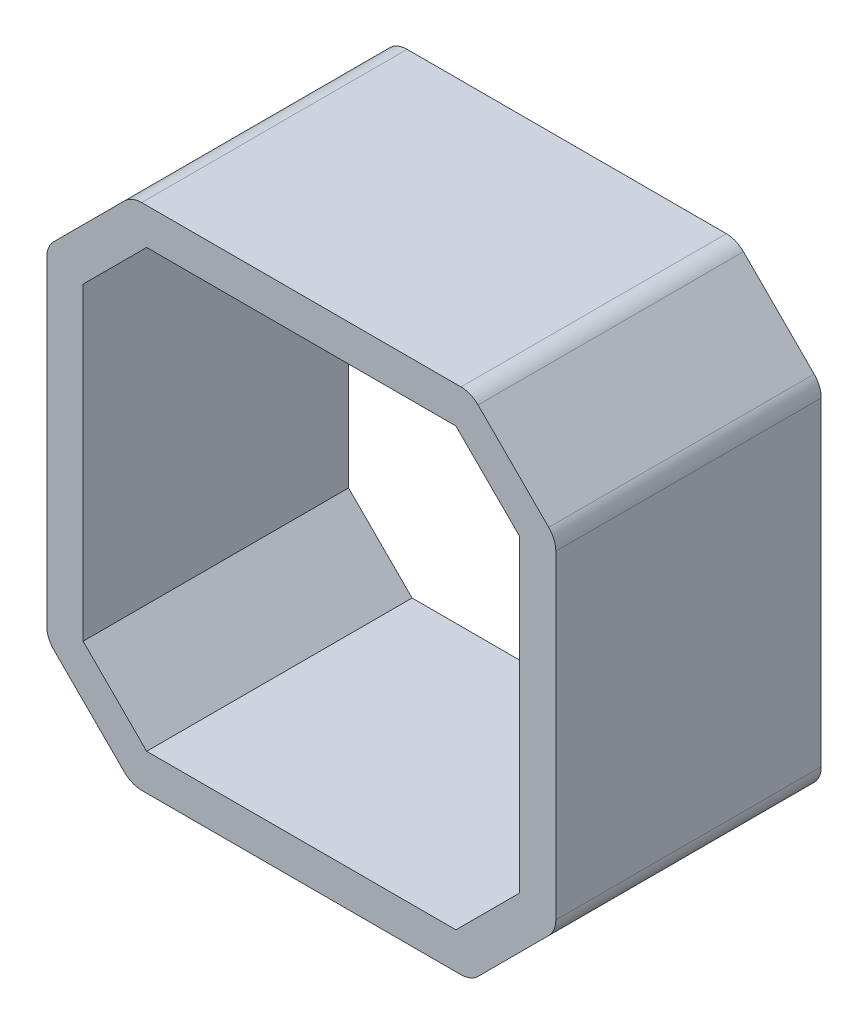
ISO-10303-21;
HEADER;
FILE_DESCRIPTION(('STEP AP214'),'2;1');
FILE_NAME('part.step','',(''),(''),'','','');
FILE_SCHEMA(('AUTOMOTIVE_DESIGN { 1 0 10303 214 1 1 1 1 }'));
ENDSEC;
DATA;
#1=APPLICATION_CONTEXT('core data for automotive mechanical design processes');
#2=APPLICATION_PROTOCOL_DEFINITION('international standard','automotive_design',2000,#1);
#3=PRODUCT_CONTEXT('',#1,'mechanical');
#4=PRODUCT('Part','Part','',(#3));
#5=PRODUCT_RELATED_PRODUCT_CATEGORY('part','',(#4));
#6=PRODUCT_DEFINITION_FORMATION('','',#4);
#7=PRODUCT_DEFINITION_CONTEXT('part definition',#1,'design');
#8=PRODUCT_DEFINITION('design','',#6,#7);
#9=PRODUCT_DEFINITION_SHAPE('','',#8);
#10=(LENGTH_UNIT() NAMED_UNIT(*) SI_UNIT(.MILLI.,.METRE.));
#11=(NAMED_UNIT(*) PLANE_ANGLE_UNIT() SI_UNIT($,.RADIAN.));
#12=(NAMED_UNIT(*) SI_UNIT($,.STERADIAN.) SOLID_ANGLE_UNIT());
#13=UNCERTAINTY_MEASURE_WITH_UNIT(LENGTH_MEASURE(1.E-05),#10,'distance_accuracy_value','');
#14=(GEOMETRIC_REPRESENTATION_CONTEXT(3) GLOBAL_UNCERTAINTY_ASSIGNED_CONTEXT((#13)) GLOBAL_UNIT_ASSIGNED_CONTEXT((#10,
#11,#12)) REPRESENTATION_CONTEXT('',''));
#15=CARTESIAN_POINT('',(0.,0.,0.));
#16=DIRECTION('',(0.,0.,1.));
#17=DIRECTION('',(1.,0.,0.));
#18=AXIS2_PLACEMENT_3D('',#15,#16,#17);
#19=CARTESIAN_POINT('',(0.,0.,10.95));
#20=DIRECTION('',(0.,0.,1.));
#21=DIRECTION('',(1.,0.,0.));
#22=AXIS2_PLACEMENT_3D('',#19,#20,#21);
#23=PLANE('',#22);
#24=DIRECTION('',(0.707106781186548,-0.707106781186547,0.));
#25=VECTOR('',#24,1.);
#26=CARTESIAN_POINT('',(21.,14.,10.95));
#27=LINE('',#26,#25);
#28=CARTESIAN_POINT('',(14.5857864376269,20.4142135623731,10.95));
#29=VERTEX_POINT('',#28);
#30=CARTESIAN_POINT('',(20.4142135623731,14.5857864376269,10.95));
#31=VERTEX_POINT('',#30);
#32=EDGE_CURVE('E484',#29,#31,#27,.T.);
#33=ORIENTED_EDGE('',*,*,#32,.F.);
#34=CARTESIAN_POINT('',(13.1715728752538,19.,10.95));
#35=DIRECTION('',(0.,0.,1.));
#36=DIRECTION('',(1.,0.,0.));
#37=AXIS2_PLACEMENT_3D('',#34,#35,#36);
#38=CIRCLE('',#37,2.);
#39=CARTESIAN_POINT('',(13.1715728752538,21.,10.95));
#40=VERTEX_POINT('',#39);
#41=EDGE_CURVE('E561',#29,#40,#38,.T.);
#42=ORIENTED_EDGE('',*,*,#41,.T.);
#43=DIRECTION('',(-1.,0.,0.));
#44=VECTOR('',#43,1.);
#45=CARTESIAN_POINT('',(-21.,21.,10.95));
#46=LINE('',#45,#44);
#47=CARTESIAN_POINT('',(-13.1715728752538,21.,10.95));
#48=VERTEX_POINT('',#47);
#49=EDGE_CURVE('E506',#40,#48,#46,.T.);
#50=ORIENTED_EDGE('',*,*,#49,.T.);
#51=CARTESIAN_POINT('',(-13.1715728752538,19.,10.95));
#52=DIRECTION('',(0.,0.,1.));
#53=DIRECTION('',(1.,0.,0.));
#54=AXIS2_PLACEMENT_3D('',#51,#52,#53);
#55=CIRCLE('',#54,2.);
#56=CARTESIAN_POINT('',(-14.5857864376269,20.4142135623731,10.95));
#57=VERTEX_POINT('',#56);
#58=EDGE_CURVE('E540',#48,#57,#55,.T.);
#59=ORIENTED_EDGE('',*,*,#58,.T.);
#60=DIRECTION('',(0.707106781186547,0.707106781186547,0.));
#61=VECTOR('',#60,1.);
#62=CARTESIAN_POINT('',(-21.,14.,10.95));
#63=LINE('',#62,#61);
#64=CARTESIAN_POINT('',(-20.4142135623731,14.5857864376269,10.95));
#65=VERTEX_POINT('',#64);
#66=EDGE_CURVE('E497',#65,#57,#63,.T.);
#67=ORIENTED_EDGE('',*,*,#66,.F.);
#68=CARTESIAN_POINT('',(-19.,13.1715728752538,10.95));
#69=DIRECTION('',(0.,0.,1.));
#70=DIRECTION('',(1.,0.,0.));
#71=AXIS2_PLACEMENT_3D('',#68,#69,#70);
#72=CIRCLE('',#71,2.);
#73=CARTESIAN_POINT('',(-21.,13.1715728752538,10.95));
#74=VERTEX_POINT('',#73);
#75=EDGE_CURVE('E543',#65,#74,#72,.T.);
#76=ORIENTED_EDGE('',*,*,#75,.T.);
#77=DIRECTION('',(0.,-1.,0.));
#78=VECTOR('',#77,1.);
#79=CARTESIAN_POINT('',(-21.,21.,10.95));
#80=LINE('',#79,#78);
#81=CARTESIAN_POINT('',(-21.,-13.1715728752538,10.95));
#82=VERTEX_POINT('',#81);
#83=EDGE_CURVE('E511',#74,#82,#80,.T.);
#84=ORIENTED_EDGE('',*,*,#83,.T.);
#85=CARTESIAN_POINT('',(-19.,-13.1715728752538,10.95));
#86=DIRECTION('',(0.,0.,1.));
#87=DIRECTION('',(1.,0.,0.));
#88=AXIS2_PLACEMENT_3D('',#85,#86,#87);
#89=CIRCLE('',#88,2.);
#90=CARTESIAN_POINT('',(-20.4142135623731,-14.5857864376269,10.95));
#91=VERTEX_POINT('',#90);
#92=EDGE_CURVE('E546',#82,#91,#89,.T.);
#93=ORIENTED_EDGE('',*,*,#92,.T.);
#94=DIRECTION('',(-0.707106781186547,0.707106781186547,0.));
#95=VECTOR('',#94,1.);
#96=CARTESIAN_POINT('',(-21.,-14.,10.95));
#97=LINE('',#96,#95);
#98=CARTESIAN_POINT('',(-14.5857864376269,-20.4142135623731,10.95));
#99=VERTEX_POINT('',#98);
#100=EDGE_CURVE('E474',#99,#91,#97,.T.);
#101=ORIENTED_EDGE('',*,*,#100,.F.);
#102=CARTESIAN_POINT('',(-13.1715728752538,-19.,10.95));
#103=DIRECTION('',(0.,0.,1.));
#104=DIRECTION('',(1.,0.,0.));
#105=AXIS2_PLACEMENT_3D('',#102,#103,#104);
#106=CIRCLE('',#105,2.);
#107=CARTESIAN_POINT('',(-13.1715728752538,-21.,10.95));
#108=VERTEX_POINT('',#107);
#109=EDGE_CURVE('E549',#99,#108,#106,.T.);
#110=ORIENTED_EDGE('',*,*,#109,.T.);
#111=DIRECTION('',(1.,0.,0.));
#112=VECTOR('',#111,1.);
#113=CARTESIAN_POINT('',(-21.,-21.,10.95));
#114=LINE('',#113,#112);
#115=CARTESIAN_POINT('',(13.1715728752538,-21.,10.95));
#116=VERTEX_POINT('',#115);
#117=EDGE_CURVE('E515',#108,#116,#114,.T.);
#118=ORIENTED_EDGE('',*,*,#117,.T.);
#119=CARTESIAN_POINT('',(13.1715728752538,-19.,10.95));
#120=DIRECTION('',(0.,0.,1.));
#121=DIRECTION('',(1.,0.,0.));
#122=AXIS2_PLACEMENT_3D('',#119,#120,#121);
#123=CIRCLE('',#122,2.);
#124=CARTESIAN_POINT('',(14.5857864376269,-20.4142135623731,10.95));
#125=VERTEX_POINT('',#124);
#126=EDGE_CURVE('E552',#116,#125,#123,.T.);
#127=ORIENTED_EDGE('',*,*,#126,.T.);
#128=DIRECTION('',(-0.707106781186547,-0.707106781186547,0.));
#129=VECTOR('',#128,1.);
#130=CARTESIAN_POINT('',(21.,-14.,10.95));
#131=LINE('',#130,#129);
#132=CARTESIAN_POINT('',(20.4142135623731,-14.5857864376269,10.95));
#133=VERTEX_POINT('',#132);
#134=EDGE_CURVE('E475',#133,#125,#131,.T.);
#135=ORIENTED_EDGE('',*,*,#134,.F.);
#136=CARTESIAN_POINT('',(19.,-13.1715728752538,10.95));
#137=DIRECTION('',(0.,0.,1.));
#138=DIRECTION('',(1.,0.,0.));
#139=AXIS2_PLACEMENT_3D('',#136,#137,#138);
#140=CIRCLE('',#139,2.);
#141=CARTESIAN_POINT('',(21.,-13.1715728752538,10.95));
#142=VERTEX_POINT('',#141);
#143=EDGE_CURVE('E555',#133,#142,#140,.T.);
#144=ORIENTED_EDGE('',*,*,#143,.T.);
#145=DIRECTION('',(0.,1.,0.));
#146=VECTOR('',#145,1.);
#147=CARTESIAN_POINT('',(21.,21.,10.95));
#148=LINE('',#147,#146);
#149=CARTESIAN_POINT('',(21.,13.1715728752538,10.95));
#150=VERTEX_POINT('',#149);
#151=EDGE_CURVE('E502',#142,#150,#148,.T.);
#152=ORIENTED_EDGE('',*,*,#151,.T.);
#153=CARTESIAN_POINT('',(19.,13.1715728752538,10.95));
#154=DIRECTION('',(0.,0.,1.));
#155=DIRECTION('',(1.,0.,0.));
#156=AXIS2_PLACEMENT_3D('',#153,#154,#155);
#157=CIRCLE('',#156,2.);
#158=EDGE_CURVE('E558',#150,#31,#157,.T.);
#159=ORIENTED_EDGE('',*,*,#158,.T.);
#160=EDGE_LOOP('',(#33,#42,#50,#59,#67,#76,#84,#93,#101,#110,#118,#127,#135,#144,#152,#159));
#161=FACE_BOUND('',#160,.T.);
#162=DIRECTION('',(1.,0.,0.));
#163=VECTOR('',#162,1.);
#164=CARTESIAN_POINT('',(-12.7573593128807,-18.,10.95));
#165=LINE('',#164,#163);
#166=CARTESIAN_POINT('',(-12.7573593128807,-18.,10.95));
#167=VERTEX_POINT('',#166);
#168=CARTESIAN_POINT('',(12.7573593128807,-18.,10.95));
#169=VERTEX_POINT('',#168);
#170=EDGE_CURVE('E367',#167,#169,#165,.T.);
#171=ORIENTED_EDGE('',*,*,#170,.F.);
#172=DIRECTION('',(0.707106781186548,-0.707106781186547,0.));
#173=VECTOR('',#172,1.);
#174=CARTESIAN_POINT('',(-18.,-12.7573593128807,10.95));
#175=LINE('',#174,#173);
#176=CARTESIAN_POINT('',(-18.,-12.7573593128807,10.95));
#177=VERTEX_POINT('',#176);
#178=EDGE_CURVE('E213',#177,#167,#175,.T.);
#179=ORIENTED_EDGE('',*,*,#178,.F.);
#180=DIRECTION('',(0.,-1.,0.));
#181=VECTOR('',#180,1.);
#182=CARTESIAN_POINT('',(-18.,12.7573593128807,10.95));
#183=LINE('',#182,#181);
#184=CARTESIAN_POINT('',(-18.,12.7573593128807,10.95));
#185=VERTEX_POINT('',#184);
#186=EDGE_CURVE('E450',#185,#177,#183,.T.);
#187=ORIENTED_EDGE('',*,*,#186,.F.);
#188=DIRECTION('',(-0.707106781186546,-0.707106781186549,0.));
#189=VECTOR('',#188,1.);
#190=CARTESIAN_POINT('',(-12.7573593128807,18.0000000000001,10.95));
#191=LINE('',#190,#189);
#192=CARTESIAN_POINT('',(-12.7573593128807,18.0000000000001,10.95));
#193=VERTEX_POINT('',#192);
#194=EDGE_CURVE('E438',#193,#185,#191,.T.);
#195=ORIENTED_EDGE('',*,*,#194,.F.);
#196=DIRECTION('',(-1.,0.,0.));
#197=VECTOR('',#196,1.);
#198=CARTESIAN_POINT('',(12.7573593128807,18.,10.95));
#199=LINE('',#198,#197);
#200=CARTESIAN_POINT('',(12.7573593128807,18.,10.95));
#201=VERTEX_POINT('',#200);
#202=EDGE_CURVE('E426',#201,#193,#199,.T.);
#203=ORIENTED_EDGE('',*,*,#202,.F.);
#204=DIRECTION('',(-0.707106781186549,0.707106781186546,0.));
#205=VECTOR('',#204,1.);
#206=CARTESIAN_POINT('',(18.,12.7573593128807,10.95));
#207=LINE('',#206,#205);
#208=CARTESIAN_POINT('',(18.,12.7573593128807,10.95));
#209=VERTEX_POINT('',#208);
#210=EDGE_CURVE('E414',#209,#201,#207,.T.);
#211=ORIENTED_EDGE('',*,*,#210,.F.);
#212=DIRECTION('',(0.,1.,0.));
#213=VECTOR('',#212,1.);
#214=CARTESIAN_POINT('',(18.,-12.7573593128807,10.95));
#215=LINE('',#214,#213);
#216=CARTESIAN_POINT('',(18.,-12.7573593128807,10.95));
#217=VERTEX_POINT('',#216);
#218=EDGE_CURVE('E402',#217,#209,#215,.T.);
#219=ORIENTED_EDGE('',*,*,#218,.F.);
#220=DIRECTION('',(0.707106781186547,0.707106781186548,0.));
#221=VECTOR('',#220,1.);
#222=CARTESIAN_POINT('',(12.7573593128807,-18.,10.95));
#223=LINE('',#222,#221);
#224=EDGE_CURVE('E397',#169,#217,#223,.T.);
#225=ORIENTED_EDGE('',*,*,#224,.F.);
#226=EDGE_LOOP('',(#171,#179,#187,#195,#203,#211,#219,#225));
#227=FACE_BOUND('',#226,.T.);
#228=ADVANCED_FACE('F197',(#161,#227),#23,.T.);
#229=CARTESIAN_POINT('',(0.,0.,-10.95));
#230=DIRECTION('',(0.,0.,1.));
#231=DIRECTION('',(1.,0.,0.));
#232=AXIS2_PLACEMENT_3D('',#229,#230,#231);
#233=PLANE('',#232);
#234=DIRECTION('',(-1.,0.,0.));
#235=VECTOR('',#234,1.);
#236=CARTESIAN_POINT('',(-21.,21.,-10.95));
#237=LINE('',#236,#235);
#238=CARTESIAN_POINT('',(13.1715728752538,21.,-10.95));
#239=VERTEX_POINT('',#238);
#240=CARTESIAN_POINT('',(-13.1715728752538,21.,-10.95));
#241=VERTEX_POINT('',#240);
#242=EDGE_CURVE('E523',#239,#241,#237,.T.);
#243=ORIENTED_EDGE('',*,*,#242,.F.);
#244=CARTESIAN_POINT('',(13.1715728752538,19.,-10.95));
#245=DIRECTION('',(0.,0.,1.));
#246=DIRECTION('',(1.,0.,0.));
#247=AXIS2_PLACEMENT_3D('',#244,#245,#246);
#248=CIRCLE('',#247,2.);
#249=CARTESIAN_POINT('',(14.5857864376269,20.4142135623731,-10.95));
#250=VERTEX_POINT('',#249);
#251=EDGE_CURVE('E592',#239,#250,#248,.F.);
#252=ORIENTED_EDGE('',*,*,#251,.T.);
#253=DIRECTION('',(-0.707106781186548,0.707106781186547,0.));
#254=VECTOR('',#253,1.);
#255=CARTESIAN_POINT('',(21.,14.,-10.95));
#256=LINE('',#255,#254);
#257=CARTESIAN_POINT('',(20.4142135623731,14.5857864376269,-10.95));
#258=VERTEX_POINT('',#257);
#259=EDGE_CURVE('E366',#258,#250,#256,.T.);
#260=ORIENTED_EDGE('',*,*,#259,.F.);
#261=CARTESIAN_POINT('',(19.,13.1715728752538,-10.95));
#262=DIRECTION('',(0.,0.,1.));
#263=DIRECTION('',(1.,0.,0.));
#264=AXIS2_PLACEMENT_3D('',#261,#262,#263);
#265=CIRCLE('',#264,2.);
#266=CARTESIAN_POINT('',(21.,13.1715728752538,-10.95));
#267=VERTEX_POINT('',#266);
#268=EDGE_CURVE('E589',#258,#267,#265,.F.);
#269=ORIENTED_EDGE('',*,*,#268,.T.);
#270=DIRECTION('',(0.,1.,0.));
#271=VECTOR('',#270,1.);
#272=CARTESIAN_POINT('',(21.,21.,-10.95));
#273=LINE('',#272,#271);
#274=CARTESIAN_POINT('',(21.,-13.1715728752538,-10.95));
#275=VERTEX_POINT('',#274);
#276=EDGE_CURVE('E501',#275,#267,#273,.T.);
#277=ORIENTED_EDGE('',*,*,#276,.F.);
#278=CARTESIAN_POINT('',(19.,-13.1715728752538,-10.95));
#279=DIRECTION('',(0.,0.,1.));
#280=DIRECTION('',(1.,0.,0.));
#281=AXIS2_PLACEMENT_3D('',#278,#279,#280);
#282=CIRCLE('',#281,2.);
#283=CARTESIAN_POINT('',(20.4142135623731,-14.5857864376269,-10.95));
#284=VERTEX_POINT('',#283);
#285=EDGE_CURVE('E586',#275,#284,#282,.F.);
#286=ORIENTED_EDGE('',*,*,#285,.T.);
#287=DIRECTION('',(0.707106781186548,0.707106781186548,0.));
#288=VECTOR('',#287,1.);
#289=CARTESIAN_POINT('',(21.,-14.,-10.95));
#290=LINE('',#289,#288);
#291=CARTESIAN_POINT('',(14.5857864376269,-20.4142135623731,-10.95));
#292=VERTEX_POINT('',#291);
#293=EDGE_CURVE('E480',#292,#284,#290,.T.);
#294=ORIENTED_EDGE('',*,*,#293,.F.);
#295=CARTESIAN_POINT('',(13.1715728752538,-19.,-10.95));
#296=DIRECTION('',(0.,0.,1.));
#297=DIRECTION('',(1.,0.,0.));
#298=AXIS2_PLACEMENT_3D('',#295,#296,#297);
#299=CIRCLE('',#298,2.);
#300=CARTESIAN_POINT('',(13.1715728752538,-21.,-10.95));
#301=VERTEX_POINT('',#300);
#302=EDGE_CURVE('E583',#292,#301,#299,.F.);
#303=ORIENTED_EDGE('',*,*,#302,.T.);
#304=DIRECTION('',(1.,0.,0.));
#305=VECTOR('',#304,1.);
#306=CARTESIAN_POINT('',(-21.,-21.,-10.95));
#307=LINE('',#306,#305);
#308=CARTESIAN_POINT('',(-13.1715728752538,-21.,-10.95));
#309=VERTEX_POINT('',#308);
#310=EDGE_CURVE('E507',#309,#301,#307,.T.);
#311=ORIENTED_EDGE('',*,*,#310,.F.);
#312=CARTESIAN_POINT('',(-13.1715728752538,-19.,-10.95));
#313=DIRECTION('',(0.,0.,1.));
#314=DIRECTION('',(1.,0.,0.));
#315=AXIS2_PLACEMENT_3D('',#312,#313,#314);
#316=CIRCLE('',#315,2.);
#317=CARTESIAN_POINT('',(-14.5857864376269,-20.4142135623731,-10.95));
#318=VERTEX_POINT('',#317);
#319=EDGE_CURVE('E580',#309,#318,#316,.F.);
#320=ORIENTED_EDGE('',*,*,#319,.T.);
#321=DIRECTION('',(0.707106781186548,-0.707106781186548,0.));
#322=VECTOR('',#321,1.);
#323=CARTESIAN_POINT('',(-21.,-14.,-10.95));
#324=LINE('',#323,#322);
#325=CARTESIAN_POINT('',(-20.4142135623731,-14.5857864376269,-10.95));
#326=VERTEX_POINT('',#325);
#327=EDGE_CURVE('E470',#326,#318,#324,.T.);
#328=ORIENTED_EDGE('',*,*,#327,.F.);
#329=CARTESIAN_POINT('',(-19.,-13.1715728752538,-10.95));
#330=DIRECTION('',(0.,0.,1.));
#331=DIRECTION('',(1.,0.,0.));
#332=AXIS2_PLACEMENT_3D('',#329,#330,#331);
#333=CIRCLE('',#332,2.);
#334=CARTESIAN_POINT('',(-21.,-13.1715728752538,-10.95));
#335=VERTEX_POINT('',#334);
#336=EDGE_CURVE('E577',#326,#335,#333,.F.);
#337=ORIENTED_EDGE('',*,*,#336,.T.);
#338=DIRECTION('',(0.,-1.,0.));
#339=VECTOR('',#338,1.);
#340=CARTESIAN_POINT('',(-21.,21.,-10.95));
#341=LINE('',#340,#339);
#342=CARTESIAN_POINT('',(-21.,13.1715728752538,-10.95));
#343=VERTEX_POINT('',#342);
#344=EDGE_CURVE('E527',#343,#335,#341,.T.);
#345=ORIENTED_EDGE('',*,*,#344,.F.);
#346=CARTESIAN_POINT('',(-19.,13.1715728752538,-10.95));
#347=DIRECTION('',(0.,0.,1.));
#348=DIRECTION('',(1.,0.,0.));
#349=AXIS2_PLACEMENT_3D('',#346,#347,#348);
#350=CIRCLE('',#349,2.);
#351=CARTESIAN_POINT('',(-20.4142135623731,14.5857864376269,-10.95));
#352=VERTEX_POINT('',#351);
#353=EDGE_CURVE('E574',#343,#352,#350,.F.);
#354=ORIENTED_EDGE('',*,*,#353,.T.);
#355=DIRECTION('',(-0.707106781186548,-0.707106781186548,0.));
#356=VECTOR('',#355,1.);
#357=CARTESIAN_POINT('',(-21.,14.,-10.95));
#358=LINE('',#357,#356);
#359=CARTESIAN_POINT('',(-14.5857864376269,20.4142135623731,-10.95));
#360=VERTEX_POINT('',#359);
#361=EDGE_CURVE('E479',#360,#352,#358,.T.);
#362=ORIENTED_EDGE('',*,*,#361,.F.);
#363=CARTESIAN_POINT('',(-13.1715728752538,19.,-10.95));
#364=DIRECTION('',(0.,0.,1.));
#365=DIRECTION('',(1.,0.,0.));
#366=AXIS2_PLACEMENT_3D('',#363,#364,#365);
#367=CIRCLE('',#366,2.);
#368=EDGE_CURVE('E571',#360,#241,#367,.F.);
#369=ORIENTED_EDGE('',*,*,#368,.T.);
#370=EDGE_LOOP('',(#243,#252,#260,#269,#277,#286,#294,#303,#311,#320,#328,#337,#345,#354,#362,#369));
#371=FACE_BOUND('',#370,.T.);
#372=DIRECTION('',(0.707106781186548,-0.707106781186547,0.));
#373=VECTOR('',#372,1.);
#374=CARTESIAN_POINT('',(-18.,-12.7573593128807,-10.95));
#375=LINE('',#374,#373);
#376=CARTESIAN_POINT('',(-18.,-12.7573593128807,-10.95));
#377=VERTEX_POINT('',#376);
#378=CARTESIAN_POINT('',(-12.7573593128807,-18.,-10.95));
#379=VERTEX_POINT('',#378);
#380=EDGE_CURVE('E370',#377,#379,#375,.T.);
#381=ORIENTED_EDGE('',*,*,#380,.T.);
#382=DIRECTION('',(1.,0.,0.));
#383=VECTOR('',#382,1.);
#384=CARTESIAN_POINT('',(-12.7573593128807,-18.,-10.95));
#385=LINE('',#384,#383);
#386=CARTESIAN_POINT('',(12.7573593128807,-18.,-10.95));
#387=VERTEX_POINT('',#386);
#388=EDGE_CURVE('E358',#379,#387,#385,.T.);
#389=ORIENTED_EDGE('',*,*,#388,.T.);
#390=DIRECTION('',(0.707106781186547,0.707106781186548,0.));
#391=VECTOR('',#390,1.);
#392=CARTESIAN_POINT('',(12.7573593128807,-18.,-10.95));
#393=LINE('',#392,#391);
#394=CARTESIAN_POINT('',(18.,-12.7573593128807,-10.95));
#395=VERTEX_POINT('',#394);
#396=EDGE_CURVE('E987',#387,#395,#393,.T.);
#397=ORIENTED_EDGE('',*,*,#396,.T.);
#398=DIRECTION('',(0.,1.,0.));
#399=VECTOR('',#398,1.);
#400=CARTESIAN_POINT('',(18.,-12.7573593128807,-10.95));
#401=LINE('',#400,#399);
#402=CARTESIAN_POINT('',(18.,12.7573593128807,-10.95));
#403=VERTEX_POINT('',#402);
#404=EDGE_CURVE('E991',#395,#403,#401,.T.);
#405=ORIENTED_EDGE('',*,*,#404,.T.);
#406=DIRECTION('',(-0.707106781186549,0.707106781186546,0.));
#407=VECTOR('',#406,1.);
#408=CARTESIAN_POINT('',(18.,12.7573593128807,-10.95));
#409=LINE('',#408,#407);
#410=CARTESIAN_POINT('',(12.7573593128807,18.,-10.95));
#411=VERTEX_POINT('',#410);
#412=EDGE_CURVE('E996',#403,#411,#409,.T.);
#413=ORIENTED_EDGE('',*,*,#412,.T.);
#414=DIRECTION('',(-1.,0.,0.));
#415=VECTOR('',#414,1.);
#416=CARTESIAN_POINT('',(12.7573593128807,18.,-10.95));
#417=LINE('',#416,#415);
#418=CARTESIAN_POINT('',(-12.7573593128807,18.0000000000001,-10.95));
#419=VERTEX_POINT('',#418);
#420=EDGE_CURVE('E1001',#411,#419,#417,.T.);
#421=ORIENTED_EDGE('',*,*,#420,.T.);
#422=DIRECTION('',(-0.707106781186546,-0.707106781186549,0.));
#423=VECTOR('',#422,1.);
#424=CARTESIAN_POINT('',(-12.7573593128807,18.0000000000001,-10.95));
#425=LINE('',#424,#423);
#426=CARTESIAN_POINT('',(-18.,12.7573593128807,-10.95));
#427=VERTEX_POINT('',#426);
#428=EDGE_CURVE('E385',#419,#427,#425,.T.);
#429=ORIENTED_EDGE('',*,*,#428,.T.);
#430=DIRECTION('',(0.,-1.,0.));
#431=VECTOR('',#430,1.);
#432=CARTESIAN_POINT('',(-18.,12.7573593128807,-10.95));
#433=LINE('',#432,#431);
#434=EDGE_CURVE('E378',#427,#377,#433,.T.);
#435=ORIENTED_EDGE('',*,*,#434,.T.);
#436=EDGE_LOOP('',(#381,#389,#397,#405,#413,#421,#429,#435));
#437=FACE_BOUND('',#436,.T.);
#438=ADVANCED_FACE('F376',(#371,#437),#233,.F.);
#439=CARTESIAN_POINT('',(21.,21.,10.95));
#440=DIRECTION('',(-1.,0.,0.));
#441=DIRECTION('',(0.,0.,1.));
#442=AXIS2_PLACEMENT_3D('',#439,#440,#441);
#443=PLANE('',#442);
#444=ORIENTED_EDGE('',*,*,#276,.T.);
#445=DIRECTION('',(0.,0.,1.));
#446=VECTOR('',#445,1.);
#447=CARTESIAN_POINT('',(21.,13.1715728752538,10.95));
#448=LINE('',#447,#446);
#449=EDGE_CURVE('E598',#267,#150,#448,.T.);
#450=ORIENTED_EDGE('',*,*,#449,.T.);
#451=ORIENTED_EDGE('',*,*,#151,.F.);
#452=DIRECTION('',(0.,0.,1.));
#453=VECTOR('',#452,1.);
#454=CARTESIAN_POINT('',(21.,-13.1715728752538,10.95));
#455=LINE('',#454,#453);
#456=EDGE_CURVE('E595',#142,#275,#455,.F.);
#457=ORIENTED_EDGE('',*,*,#456,.T.);
#458=EDGE_LOOP('',(#444,#450,#451,#457));
#459=FACE_BOUND('',#458,.T.);
#460=ADVANCED_FACE('F665',(#459),#443,.F.);
#461=CARTESIAN_POINT('',(-21.,21.,10.95));
#462=DIRECTION('',(0.,-1.,0.));
#463=DIRECTION('',(0.,0.,-1.));
#464=AXIS2_PLACEMENT_3D('',#461,#462,#463);
#465=PLANE('',#464);
#466=ORIENTED_EDGE('',*,*,#49,.F.);
#467=DIRECTION('',(0.,0.,1.));
#468=VECTOR('',#467,1.);
#469=CARTESIAN_POINT('',(13.1715728752538,21.,10.95));
#470=LINE('',#469,#468);
#471=EDGE_CURVE('E568',#40,#239,#470,.F.);
#472=ORIENTED_EDGE('',*,*,#471,.T.);
#473=ORIENTED_EDGE('',*,*,#242,.T.);
#474=DIRECTION('',(0.,0.,1.));
#475=VECTOR('',#474,1.);
#476=CARTESIAN_POINT('',(-13.1715728752538,21.,10.95));
#477=LINE('',#476,#475);
#478=EDGE_CURVE('E564',#241,#48,#477,.T.);
#479=ORIENTED_EDGE('',*,*,#478,.T.);
#480=EDGE_LOOP('',(#466,#472,#473,#479));
#481=FACE_BOUND('',#480,.T.);
#482=ADVANCED_FACE('F645',(#481),#465,.F.);
#483=CARTESIAN_POINT('',(-21.,21.,10.95));
#484=DIRECTION('',(1.,0.,0.));
#485=DIRECTION('',(0.,0.,-1.));
#486=AXIS2_PLACEMENT_3D('',#483,#484,#485);
#487=PLANE('',#486);
#488=ORIENTED_EDGE('',*,*,#344,.T.);
#489=DIRECTION('',(0.,0.,1.));
#490=VECTOR('',#489,1.);
#491=CARTESIAN_POINT('',(-21.,-13.1715728752538,10.95));
#492=LINE('',#491,#490);
#493=EDGE_CURVE('E626',#335,#82,#492,.T.);
#494=ORIENTED_EDGE('',*,*,#493,.T.);
#495=ORIENTED_EDGE('',*,*,#83,.F.);
#496=DIRECTION('',(0.,0.,1.));
#497=VECTOR('',#496,1.);
#498=CARTESIAN_POINT('',(-21.,13.1715728752538,10.95));
#499=LINE('',#498,#497);
#500=EDGE_CURVE('E623',#74,#343,#499,.F.);
#501=ORIENTED_EDGE('',*,*,#500,.T.);
#502=EDGE_LOOP('',(#488,#494,#495,#501));
#503=FACE_BOUND('',#502,.T.);
#504=ADVANCED_FACE('F700',(#503),#487,.F.);
#505=CARTESIAN_POINT('',(-21.,-21.,10.95));
#506=DIRECTION('',(0.,1.,0.));
#507=DIRECTION('',(0.,0.,1.));
#508=AXIS2_PLACEMENT_3D('',#505,#506,#507);
#509=PLANE('',#508);
#510=ORIENTED_EDGE('',*,*,#310,.T.);
#511=DIRECTION('',(0.,0.,1.));
#512=VECTOR('',#511,1.);
#513=CARTESIAN_POINT('',(13.1715728752538,-21.,10.95));
#514=LINE('',#513,#512);
#515=EDGE_CURVE('E612',#301,#116,#514,.T.);
#516=ORIENTED_EDGE('',*,*,#515,.T.);
#517=ORIENTED_EDGE('',*,*,#117,.F.);
#518=DIRECTION('',(0.,0.,1.));
#519=VECTOR('',#518,1.);
#520=CARTESIAN_POINT('',(-13.1715728752538,-21.,10.95));
#521=LINE('',#520,#519);
#522=EDGE_CURVE('E609',#108,#309,#521,.F.);
#523=ORIENTED_EDGE('',*,*,#522,.T.);
#524=EDGE_LOOP('',(#510,#516,#517,#523));
#525=FACE_BOUND('',#524,.T.);
#526=ADVANCED_FACE('F683',(#525),#509,.F.);
#527=CARTESIAN_POINT('',(-21.,14.,-10.951));
#528=DIRECTION('',(0.707106781186547,-0.707106781186547,0.));
#529=DIRECTION('',(0.707106781186548,0.707106781186548,0.));
#530=AXIS2_PLACEMENT_3D('',#527,#528,#529);
#531=PLANE('',#530);
#532=ORIENTED_EDGE('',*,*,#361,.T.);
#533=DIRECTION('',(0.,0.,1.));
#534=VECTOR('',#533,1.);
#535=CARTESIAN_POINT('',(-20.4142135623731,14.5857864376269,-10.951));
#536=LINE('',#535,#534);
#537=EDGE_CURVE('E14',#352,#65,#536,.T.);
#538=ORIENTED_EDGE('',*,*,#537,.T.);
#539=ORIENTED_EDGE('',*,*,#66,.T.);
#540=DIRECTION('',(0.,0.,1.));
#541=VECTOR('',#540,1.);
#542=CARTESIAN_POINT('',(-14.5857864376269,20.4142135623731,-10.951));
#543=LINE('',#542,#541);
#544=EDGE_CURVE('E206',#57,#360,#543,.F.);
#545=ORIENTED_EDGE('',*,*,#544,.T.);
#546=EDGE_LOOP('',(#532,#538,#539,#545));
#547=FACE_BOUND('',#546,.T.);
#548=ADVANCED_FACE('F633',(#547),#531,.F.);
#549=CARTESIAN_POINT('',(-21.,-14.,-10.951));
#550=DIRECTION('',(0.707106781186547,0.707106781186547,0.));
#551=DIRECTION('',(-0.707106781186548,0.707106781186548,0.));
#552=AXIS2_PLACEMENT_3D('',#549,#550,#551);
#553=PLANE('',#552);
#554=ORIENTED_EDGE('',*,*,#327,.T.);
#555=DIRECTION('',(0.,0.,1.));
#556=VECTOR('',#555,1.);
#557=CARTESIAN_POINT('',(-14.5857864376269,-20.4142135623731,-10.951));
#558=LINE('',#557,#556);
#559=EDGE_CURVE('E619',#318,#99,#558,.T.);
#560=ORIENTED_EDGE('',*,*,#559,.T.);
#561=ORIENTED_EDGE('',*,*,#100,.T.);
#562=DIRECTION('',(0.,0.,1.));
#563=VECTOR('',#562,1.);
#564=CARTESIAN_POINT('',(-20.4142135623731,-14.5857864376269,-10.951));
#565=LINE('',#564,#563);
#566=EDGE_CURVE('E616',#91,#326,#565,.F.);
#567=ORIENTED_EDGE('',*,*,#566,.T.);
#568=EDGE_LOOP('',(#554,#560,#561,#567));
#569=FACE_BOUND('',#568,.T.);
#570=ADVANCED_FACE('F691',(#569),#553,.F.);
#571=CARTESIAN_POINT('',(21.,-14.,-10.951));
#572=DIRECTION('',(-0.707106781186547,0.707106781186547,0.));
#573=DIRECTION('',(-0.707106781186548,-0.707106781186548,0.));
#574=AXIS2_PLACEMENT_3D('',#571,#572,#573);
#575=PLANE('',#574);
#576=ORIENTED_EDGE('',*,*,#293,.T.);
#577=DIRECTION('',(0.,0.,1.));
#578=VECTOR('',#577,1.);
#579=CARTESIAN_POINT('',(20.4142135623731,-14.5857864376269,-10.951));
#580=LINE('',#579,#578);
#581=EDGE_CURVE('E605',#284,#133,#580,.T.);
#582=ORIENTED_EDGE('',*,*,#581,.T.);
#583=ORIENTED_EDGE('',*,*,#134,.T.);
#584=DIRECTION('',(0.,0.,1.));
#585=VECTOR('',#584,1.);
#586=CARTESIAN_POINT('',(14.5857864376269,-20.4142135623731,-10.951));
#587=LINE('',#586,#585);
#588=EDGE_CURVE('E602',#125,#292,#587,.F.);
#589=ORIENTED_EDGE('',*,*,#588,.T.);
#590=EDGE_LOOP('',(#576,#582,#583,#589));
#591=FACE_BOUND('',#590,.T.);
#592=ADVANCED_FACE('F673',(#591),#575,.F.);
#593=CARTESIAN_POINT('',(21.,14.,-10.951));
#594=DIRECTION('',(-0.707106781186547,-0.707106781186548,0.));
#595=DIRECTION('',(0.707106781186548,-0.707106781186547,0.));
#596=AXIS2_PLACEMENT_3D('',#593,#594,#595);
#597=PLANE('',#596);
#598=ORIENTED_EDGE('',*,*,#259,.T.);
#599=DIRECTION('',(0.,0.,1.));
#600=VECTOR('',#599,1.);
#601=CARTESIAN_POINT('',(14.5857864376269,20.4142135623731,-10.951));
#602=LINE('',#601,#600);
#603=EDGE_CURVE('E536',#250,#29,#602,.T.);
#604=ORIENTED_EDGE('',*,*,#603,.T.);
#605=ORIENTED_EDGE('',*,*,#32,.T.);
#606=DIRECTION('',(0.,0.,1.));
#607=VECTOR('',#606,1.);
#608=CARTESIAN_POINT('',(20.4142135623731,14.5857864376269,-10.951));
#609=LINE('',#608,#607);
#610=EDGE_CURVE('E519',#31,#258,#609,.F.);
#611=ORIENTED_EDGE('',*,*,#610,.T.);
#612=EDGE_LOOP('',(#598,#604,#605,#611));
#613=FACE_BOUND('',#612,.T.);
#614=ADVANCED_FACE('F655',(#613),#597,.F.);
#615=CARTESIAN_POINT('',(13.1715728752538,19.,-10.951));
#616=DIRECTION('',(0.,0.,1.));
#617=DIRECTION('',(1.,0.,0.));
#618=AXIS2_PLACEMENT_3D('',#615,#616,#617);
#619=CYLINDRICAL_SURFACE('',#618,2.);
#620=ORIENTED_EDGE('',*,*,#251,.F.);
#621=ORIENTED_EDGE('',*,*,#471,.F.);
#622=ORIENTED_EDGE('',*,*,#41,.F.);
#623=ORIENTED_EDGE('',*,*,#603,.F.);
#624=EDGE_LOOP('',(#620,#621,#622,#623));
#625=FACE_BOUND('',#624,.T.);
#626=ADVANCED_FACE('F653',(#625),#619,.T.);
#627=CARTESIAN_POINT('',(19.,13.1715728752538,10.95));
#628=DIRECTION('',(0.,0.,1.));
#629=DIRECTION('',(1.,0.,0.));
#630=AXIS2_PLACEMENT_3D('',#627,#628,#629);
#631=CYLINDRICAL_SURFACE('',#630,2.);
#632=ORIENTED_EDGE('',*,*,#268,.F.);
#633=ORIENTED_EDGE('',*,*,#610,.F.);
#634=ORIENTED_EDGE('',*,*,#158,.F.);
#635=ORIENTED_EDGE('',*,*,#449,.F.);
#636=EDGE_LOOP('',(#632,#633,#634,#635));
#637=FACE_BOUND('',#636,.T.);
#638=ADVANCED_FACE('F662',(#637),#631,.T.);
#639=CARTESIAN_POINT('',(19.,-13.1715728752538,-10.951));
#640=DIRECTION('',(0.,0.,1.));
#641=DIRECTION('',(1.,0.,0.));
#642=AXIS2_PLACEMENT_3D('',#639,#640,#641);
#643=CYLINDRICAL_SURFACE('',#642,2.);
#644=ORIENTED_EDGE('',*,*,#285,.F.);
#645=ORIENTED_EDGE('',*,*,#456,.F.);
#646=ORIENTED_EDGE('',*,*,#143,.F.);
#647=ORIENTED_EDGE('',*,*,#581,.F.);
#648=EDGE_LOOP('',(#644,#645,#646,#647));
#649=FACE_BOUND('',#648,.T.);
#650=ADVANCED_FACE('F671',(#649),#643,.T.);
#651=CARTESIAN_POINT('',(13.1715728752538,-19.,10.95));
#652=DIRECTION('',(0.,0.,1.));
#653=DIRECTION('',(1.,0.,0.));
#654=AXIS2_PLACEMENT_3D('',#651,#652,#653);
#655=CYLINDRICAL_SURFACE('',#654,2.);
#656=ORIENTED_EDGE('',*,*,#302,.F.);
#657=ORIENTED_EDGE('',*,*,#588,.F.);
#658=ORIENTED_EDGE('',*,*,#126,.F.);
#659=ORIENTED_EDGE('',*,*,#515,.F.);
#660=EDGE_LOOP('',(#656,#657,#658,#659));
#661=FACE_BOUND('',#660,.T.);
#662=ADVANCED_FACE('F680',(#661),#655,.T.);
#663=CARTESIAN_POINT('',(-13.1715728752538,-19.,-10.951));
#664=DIRECTION('',(0.,0.,1.));
#665=DIRECTION('',(1.,0.,0.));
#666=AXIS2_PLACEMENT_3D('',#663,#664,#665);
#667=CYLINDRICAL_SURFACE('',#666,2.);
#668=ORIENTED_EDGE('',*,*,#319,.F.);
#669=ORIENTED_EDGE('',*,*,#522,.F.);
#670=ORIENTED_EDGE('',*,*,#109,.F.);
#671=ORIENTED_EDGE('',*,*,#559,.F.);
#672=EDGE_LOOP('',(#668,#669,#670,#671));
#673=FACE_BOUND('',#672,.T.);
#674=ADVANCED_FACE('F689',(#673),#667,.T.);
#675=CARTESIAN_POINT('',(-19.,-13.1715728752538,10.95));
#676=DIRECTION('',(0.,0.,1.));
#677=DIRECTION('',(1.,0.,0.));
#678=AXIS2_PLACEMENT_3D('',#675,#676,#677);
#679=CYLINDRICAL_SURFACE('',#678,2.);
#680=ORIENTED_EDGE('',*,*,#336,.F.);
#681=ORIENTED_EDGE('',*,*,#566,.F.);
#682=ORIENTED_EDGE('',*,*,#92,.F.);
#683=ORIENTED_EDGE('',*,*,#493,.F.);
#684=EDGE_LOOP('',(#680,#681,#682,#683));
#685=FACE_BOUND('',#684,.T.);
#686=ADVANCED_FACE('F697',(#685),#679,.T.);
#687=CARTESIAN_POINT('',(-19.,13.1715728752538,-10.951));
#688=DIRECTION('',(0.,0.,1.));
#689=DIRECTION('',(1.,0.,0.));
#690=AXIS2_PLACEMENT_3D('',#687,#688,#689);
#691=CYLINDRICAL_SURFACE('',#690,2.);
#692=ORIENTED_EDGE('',*,*,#353,.F.);
#693=ORIENTED_EDGE('',*,*,#500,.F.);
#694=ORIENTED_EDGE('',*,*,#75,.F.);
#695=ORIENTED_EDGE('',*,*,#537,.F.);
#696=EDGE_LOOP('',(#692,#693,#694,#695));
#697=FACE_BOUND('',#696,.T.);
#698=ADVANCED_FACE('F703',(#697),#691,.T.);
#699=CARTESIAN_POINT('',(-13.1715728752538,19.,10.95));
#700=DIRECTION('',(0.,0.,1.));
#701=DIRECTION('',(1.,0.,0.));
#702=AXIS2_PLACEMENT_3D('',#699,#700,#701);
#703=CYLINDRICAL_SURFACE('',#702,2.);
#704=ORIENTED_EDGE('',*,*,#368,.F.);
#705=ORIENTED_EDGE('',*,*,#544,.F.);
#706=ORIENTED_EDGE('',*,*,#58,.F.);
#707=ORIENTED_EDGE('',*,*,#478,.F.);
#708=EDGE_LOOP('',(#704,#705,#706,#707));
#709=FACE_BOUND('',#708,.T.);
#710=ADVANCED_FACE('F199',(#709),#703,.T.);
#711=CARTESIAN_POINT('',(-18.,-12.7573593128807,10.95));
#712=DIRECTION('',(0.707106781186547,0.707106781186548,0.));
#713=DIRECTION('',(-0.707106781186548,0.707106781186547,0.));
#714=AXIS2_PLACEMENT_3D('',#711,#712,#713);
#715=PLANE('',#714);
#716=DIRECTION('',(0.,0.,-1.));
#717=VECTOR('',#716,1.);
#718=CARTESIAN_POINT('',(-18.,-12.7573593128807,10.95));
#719=LINE('',#718,#717);
#720=EDGE_CURVE('E380',#177,#377,#719,.T.);
#721=ORIENTED_EDGE('',*,*,#720,.F.);
#722=ORIENTED_EDGE('',*,*,#178,.T.);
#723=DIRECTION('',(0.,0.,-1.));
#724=VECTOR('',#723,1.);
#725=CARTESIAN_POINT('',(-12.7573593128807,-18.,10.95));
#726=LINE('',#725,#724);
#727=EDGE_CURVE('E360',#167,#379,#726,.T.);
#728=ORIENTED_EDGE('',*,*,#727,.T.);
#729=ORIENTED_EDGE('',*,*,#380,.F.);
#730=EDGE_LOOP('',(#721,#722,#728,#729));
#731=FACE_BOUND('',#730,.T.);
#732=ADVANCED_FACE('F369',(#731),#715,.T.);
#733=CARTESIAN_POINT('',(-18.,12.7573593128807,10.95));
#734=DIRECTION('',(1.,0.,0.));
#735=DIRECTION('',(0.,0.,-1.));
#736=AXIS2_PLACEMENT_3D('',#733,#734,#735);
#737=PLANE('',#736);
#738=DIRECTION('',(0.,0.,-1.));
#739=VECTOR('',#738,1.);
#740=CARTESIAN_POINT('',(-18.,12.7573593128807,10.95));
#741=LINE('',#740,#739);
#742=EDGE_CURVE('E373',#185,#427,#741,.T.);
#743=ORIENTED_EDGE('',*,*,#742,.F.);
#744=ORIENTED_EDGE('',*,*,#186,.T.);
#745=ORIENTED_EDGE('',*,*,#720,.T.);
#746=ORIENTED_EDGE('',*,*,#434,.F.);
#747=EDGE_LOOP('',(#743,#744,#745,#746));
#748=FACE_BOUND('',#747,.T.);
#749=ADVANCED_FACE('F836',(#748),#737,.T.);
#750=CARTESIAN_POINT('',(-12.7573593128807,18.0000000000001,10.95));
#751=DIRECTION('',(0.707106781186549,-0.707106781186546,0.));
#752=DIRECTION('',(0.707106781186546,0.707106781186549,0.));
#753=AXIS2_PLACEMENT_3D('',#750,#751,#752);
#754=PLANE('',#753);
#755=DIRECTION('',(0.,0.,-1.));
#756=VECTOR('',#755,1.);
#757=CARTESIAN_POINT('',(-12.7573593128807,18.0000000000001,10.95));
#758=LINE('',#757,#756);
#759=EDGE_CURVE('E446',#193,#419,#758,.T.);
#760=ORIENTED_EDGE('',*,*,#759,.F.);
#761=ORIENTED_EDGE('',*,*,#194,.T.);
#762=ORIENTED_EDGE('',*,*,#742,.T.);
#763=ORIENTED_EDGE('',*,*,#428,.F.);
#764=EDGE_LOOP('',(#760,#761,#762,#763));
#765=FACE_BOUND('',#764,.T.);
#766=ADVANCED_FACE('F845',(#765),#754,.T.);
#767=CARTESIAN_POINT('',(12.7573593128807,18.,10.95));
#768=DIRECTION('',(0.,-1.,0.));
#769=DIRECTION('',(1.,0.,0.));
#770=AXIS2_PLACEMENT_3D('',#767,#768,#769);
#771=PLANE('',#770);
#772=DIRECTION('',(0.,0.,-1.));
#773=VECTOR('',#772,1.);
#774=CARTESIAN_POINT('',(12.7573593128807,18.,10.95));
#775=LINE('',#774,#773);
#776=EDGE_CURVE('E434',#201,#411,#775,.T.);
#777=ORIENTED_EDGE('',*,*,#776,.F.);
#778=ORIENTED_EDGE('',*,*,#202,.T.);
#779=ORIENTED_EDGE('',*,*,#759,.T.);
#780=ORIENTED_EDGE('',*,*,#420,.F.);
#781=EDGE_LOOP('',(#777,#778,#779,#780));
#782=FACE_BOUND('',#781,.T.);
#783=ADVANCED_FACE('F855',(#782),#771,.T.);
#784=CARTESIAN_POINT('',(18.,12.7573593128807,10.95));
#785=DIRECTION('',(-0.707106781186546,-0.707106781186549,0.));
#786=DIRECTION('',(0.707106781186549,-0.707106781186546,0.));
#787=AXIS2_PLACEMENT_3D('',#784,#785,#786);
#788=PLANE('',#787);
#789=DIRECTION('',(0.,0.,-1.));
#790=VECTOR('',#789,1.);
#791=CARTESIAN_POINT('',(18.,12.7573593128807,10.95));
#792=LINE('',#791,#790);
#793=EDGE_CURVE('E422',#209,#403,#792,.T.);
#794=ORIENTED_EDGE('',*,*,#793,.F.);
#795=ORIENTED_EDGE('',*,*,#210,.T.);
#796=ORIENTED_EDGE('',*,*,#776,.T.);
#797=ORIENTED_EDGE('',*,*,#412,.F.);
#798=EDGE_LOOP('',(#794,#795,#796,#797));
#799=FACE_BOUND('',#798,.T.);
#800=ADVANCED_FACE('F865',(#799),#788,.T.);
#801=CARTESIAN_POINT('',(18.,-12.7573593128807,10.95));
#802=DIRECTION('',(-1.,0.,0.));
#803=DIRECTION('',(0.,-1.,0.));
#804=AXIS2_PLACEMENT_3D('',#801,#802,#803);
#805=PLANE('',#804);
#806=DIRECTION('',(0.,0.,-1.));
#807=VECTOR('',#806,1.);
#808=CARTESIAN_POINT('',(18.,-12.7573593128807,10.95));
#809=LINE('',#808,#807);
#810=EDGE_CURVE('E410',#217,#395,#809,.T.);
#811=ORIENTED_EDGE('',*,*,#810,.F.);
#812=ORIENTED_EDGE('',*,*,#218,.T.);
#813=ORIENTED_EDGE('',*,*,#793,.T.);
#814=ORIENTED_EDGE('',*,*,#404,.F.);
#815=EDGE_LOOP('',(#811,#812,#813,#814));
#816=FACE_BOUND('',#815,.T.);
#817=ADVANCED_FACE('F875',(#816),#805,.T.);
#818=CARTESIAN_POINT('',(12.7573593128807,-18.,10.95));
#819=DIRECTION('',(-0.707106781186548,0.707106781186547,0.));
#820=DIRECTION('',(-0.707106781186547,-0.707106781186548,0.));
#821=AXIS2_PLACEMENT_3D('',#818,#819,#820);
#822=PLANE('',#821);
#823=DIRECTION('',(0.,0.,-1.));
#824=VECTOR('',#823,1.);
#825=CARTESIAN_POINT('',(12.7573593128807,-18.,10.95));
#826=LINE('',#825,#824);
#827=EDGE_CURVE('E221',#169,#387,#826,.T.);
#828=ORIENTED_EDGE('',*,*,#827,.F.);
#829=ORIENTED_EDGE('',*,*,#224,.T.);
#830=ORIENTED_EDGE('',*,*,#810,.T.);
#831=ORIENTED_EDGE('',*,*,#396,.F.);
#832=EDGE_LOOP('',(#828,#829,#830,#831));
#833=FACE_BOUND('',#832,.T.);
#834=ADVANCED_FACE('F885',(#833),#822,.T.);
#835=CARTESIAN_POINT('',(-12.7573593128807,-18.,10.95));
#836=DIRECTION('',(0.,1.,0.));
#837=DIRECTION('',(0.,0.,1.));
#838=AXIS2_PLACEMENT_3D('',#835,#836,#837);
#839=PLANE('',#838);
#840=ORIENTED_EDGE('',*,*,#727,.F.);
#841=ORIENTED_EDGE('',*,*,#170,.T.);
#842=ORIENTED_EDGE('',*,*,#827,.T.);
#843=ORIENTED_EDGE('',*,*,#388,.F.);
#844=EDGE_LOOP('',(#840,#841,#842,#843));
#845=FACE_BOUND('',#844,.T.);
#846=ADVANCED_FACE('F359',(#845),#839,.T.);
#847=CLOSED_SHELL('',(#228,#438,#460,#482,#504,#526,#548,#570,#592,#614,#626,#638,#650,#662,
#674,#686,#698,#710,#732,#749,#766,#783,#800,#817,#834,#846));
#848=MANIFOLD_SOLID_BREP('B2',#847);
#849=ADVANCED_BREP_SHAPE_REPRESENTATION('',(#18,#848),#14);
#850=SHAPE_DEFINITION_REPRESENTATION(#9,#849);
ENDSEC;
END-ISO-10303-21;
